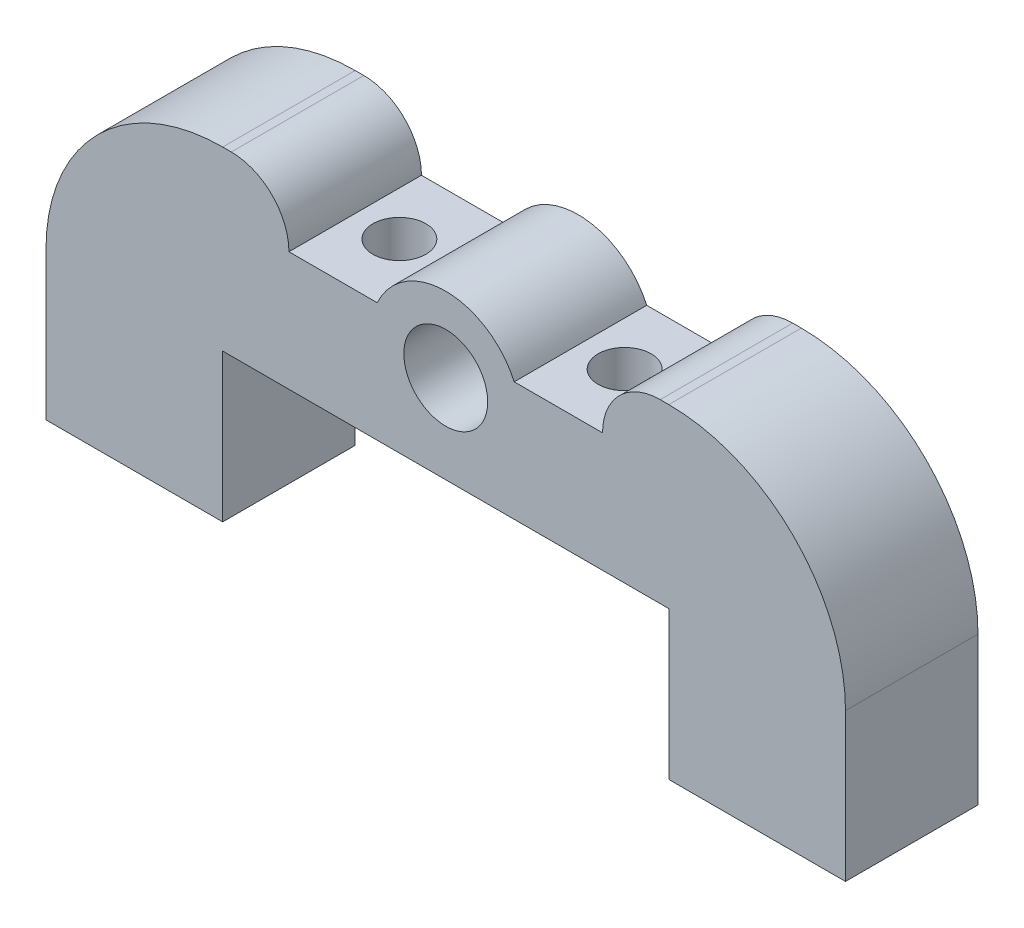
ISO-10303-21;
HEADER;
FILE_DESCRIPTION(('STEP AP214'),'2;1');
FILE_NAME('part.step','',(''),(''),'','','');
FILE_SCHEMA(('AUTOMOTIVE_DESIGN { 1 0 10303 214 1 1 1 1 }'));
ENDSEC;
DATA;
#1=APPLICATION_CONTEXT('core data for automotive mechanical design processes');
#2=APPLICATION_PROTOCOL_DEFINITION('international standard','automotive_design',2000,#1);
#3=PRODUCT_CONTEXT('',#1,'mechanical');
#4=PRODUCT('Part','Part','',(#3));
#5=PRODUCT_RELATED_PRODUCT_CATEGORY('part','',(#4));
#6=PRODUCT_DEFINITION_FORMATION('','',#4);
#7=PRODUCT_DEFINITION_CONTEXT('part definition',#1,'design');
#8=PRODUCT_DEFINITION('design','',#6,#7);
#9=PRODUCT_DEFINITION_SHAPE('','',#8);
#10=(LENGTH_UNIT() NAMED_UNIT(*) SI_UNIT(.MILLI.,.METRE.));
#11=(NAMED_UNIT(*) PLANE_ANGLE_UNIT() SI_UNIT($,.RADIAN.));
#12=(NAMED_UNIT(*) SI_UNIT($,.STERADIAN.) SOLID_ANGLE_UNIT());
#13=UNCERTAINTY_MEASURE_WITH_UNIT(LENGTH_MEASURE(1.E-05),#10,'distance_accuracy_value','');
#14=(GEOMETRIC_REPRESENTATION_CONTEXT(3) GLOBAL_UNCERTAINTY_ASSIGNED_CONTEXT((#13)) GLOBAL_UNIT_ASSIGNED_CONTEXT((#10,
#11,#12)) REPRESENTATION_CONTEXT('',''));
#15=CARTESIAN_POINT('',(0.,0.,0.));
#16=DIRECTION('',(0.,0.,1.));
#17=DIRECTION('',(1.,0.,0.));
#18=AXIS2_PLACEMENT_3D('',#15,#16,#17);
#19=CARTESIAN_POINT('',(0.,12.0931338135657,-0.00100000000000013));
#20=DIRECTION('',(0.,-1.,0.));
#21=DIRECTION('',(0.,0.,-1.));
#22=AXIS2_PLACEMENT_3D('',#19,#20,#21);
#23=PLANE('',#22);
#24=DIRECTION('',(-1.,0.,0.));
#25=VECTOR('',#24,1.);
#26=CARTESIAN_POINT('',(0.,12.0931338135657,0.));
#27=LINE('',#26,#25);
#28=CARTESIAN_POINT('',(7.,12.0931338135657,0.));
#29=VERTEX_POINT('',#28);
#30=CARTESIAN_POINT('',(3.,12.0931338135657,0.));
#31=VERTEX_POINT('',#30);
#32=EDGE_CURVE('E182',#29,#31,#27,.T.);
#33=ORIENTED_EDGE('',*,*,#32,.T.);
#34=DIRECTION('',(0.,0.,1.));
#35=VECTOR('',#34,1.);
#36=CARTESIAN_POINT('',(3.,12.0931338135657,-0.00100000000000013));
#37=LINE('',#36,#35);
#38=CARTESIAN_POINT('',(3.,12.0931338135657,6.));
#39=VERTEX_POINT('',#38);
#40=EDGE_CURVE('E204',#31,#39,#37,.T.);
#41=ORIENTED_EDGE('',*,*,#40,.T.);
#42=DIRECTION('',(1.,0.,0.));
#43=VECTOR('',#42,1.);
#44=CARTESIAN_POINT('',(0.,12.0931338135657,6.));
#45=LINE('',#44,#43);
#46=CARTESIAN_POINT('',(7.,12.0931338135657,6.));
#47=VERTEX_POINT('',#46);
#48=EDGE_CURVE('E177',#39,#47,#45,.T.);
#49=ORIENTED_EDGE('',*,*,#48,.T.);
#50=DIRECTION('',(0.,0.,1.));
#51=VECTOR('',#50,1.);
#52=CARTESIAN_POINT('',(7.,12.0931338135657,-0.00100000000000013));
#53=LINE('',#52,#51);
#54=EDGE_CURVE('E167',#29,#47,#53,.T.);
#55=ORIENTED_EDGE('',*,*,#54,.F.);
#56=EDGE_LOOP('',(#33,#41,#49,#55));
#57=FACE_BOUND('',#56,.T.);
#58=CARTESIAN_POINT('',(5.,12.0931338135657,3.));
#59=DIRECTION('',(0.,1.,0.));
#60=DIRECTION('',(0.,0.,1.));
#61=AXIS2_PLACEMENT_3D('',#58,#59,#60);
#62=CIRCLE('',#61,1.2);
#63=CARTESIAN_POINT('',(5.,12.0931338135657,4.2));
#64=VERTEX_POINT('',#63);
#65=EDGE_CURVE('E399',#64,#64,#62,.T.);
#66=ORIENTED_EDGE('',*,*,#65,.F.);
#67=EDGE_LOOP('',(#66));
#68=FACE_BOUND('',#67,.T.);
#69=ADVANCED_FACE('F40',(#57,#68),#23,.F.);
#70=CARTESIAN_POINT('',(0.,14.7,6.));
#71=DIRECTION('',(0.,1.,0.));
#72=DIRECTION('',(0.,0.,1.));
#73=AXIS2_PLACEMENT_3D('',#70,#71,#72);
#74=PLANE('',#73);
#75=DIRECTION('',(1.,0.,0.));
#76=VECTOR('',#75,1.);
#77=CARTESIAN_POINT('',(0.,14.7,0.));
#78=LINE('',#77,#76);
#79=CARTESIAN_POINT('',(19.8099981186224,14.7,0.));
#80=VERTEX_POINT('',#79);
#81=CARTESIAN_POINT('',(20.2,14.7,0.));
#82=VERTEX_POINT('',#81);
#83=EDGE_CURVE('E287',#80,#82,#78,.T.);
#84=ORIENTED_EDGE('',*,*,#83,.F.);
#85=DIRECTION('',(0.,0.,1.));
#86=VECTOR('',#85,1.);
#87=CARTESIAN_POINT('',(19.8099981186224,14.7,6.));
#88=LINE('',#87,#86);
#89=CARTESIAN_POINT('',(19.8099981186224,14.7,6.));
#90=VERTEX_POINT('',#89);
#91=EDGE_CURVE('E323',#80,#90,#88,.T.);
#92=ORIENTED_EDGE('',*,*,#91,.T.);
#93=DIRECTION('',(1.,0.,0.));
#94=VECTOR('',#93,1.);
#95=CARTESIAN_POINT('',(0.,14.7,6.));
#96=LINE('',#95,#94);
#97=CARTESIAN_POINT('',(20.2,14.7,6.));
#98=VERTEX_POINT('',#97);
#99=EDGE_CURVE('E250',#90,#98,#96,.T.);
#100=ORIENTED_EDGE('',*,*,#99,.T.);
#101=DIRECTION('',(0.,0.,-1.));
#102=VECTOR('',#101,1.);
#103=CARTESIAN_POINT('',(20.2,14.7,6.));
#104=LINE('',#103,#102);
#105=EDGE_CURVE('E292',#98,#82,#104,.T.);
#106=ORIENTED_EDGE('',*,*,#105,.T.);
#107=EDGE_LOOP('',(#84,#92,#100,#106));
#108=FACE_BOUND('',#107,.T.);
#109=ADVANCED_FACE('F340',(#108),#74,.T.);
#110=CARTESIAN_POINT('',(0.,6.7,6.));
#111=DIRECTION('',(0.,0.,-1.));
#112=DIRECTION('',(-1.,0.,0.));
#113=AXIS2_PLACEMENT_3D('',#110,#111,#112);
#114=CYLINDRICAL_SURFACE('',#113,8.);
#115=CARTESIAN_POINT('',(0.,6.7,0.));
#116=DIRECTION('',(0.,0.,1.));
#117=DIRECTION('',(1.,0.,0.));
#118=AXIS2_PLACEMENT_3D('',#115,#116,#117);
#119=CIRCLE('',#118,8.);
#120=CARTESIAN_POINT('',(-8.,6.7,0.));
#121=VERTEX_POINT('',#120);
#122=CARTESIAN_POINT('',(0.,14.7,0.));
#123=VERTEX_POINT('',#122);
#124=EDGE_CURVE('E217',#121,#123,#119,.F.);
#125=ORIENTED_EDGE('',*,*,#124,.F.);
#126=DIRECTION('',(0.,0.,-1.));
#127=VECTOR('',#126,1.);
#128=CARTESIAN_POINT('',(-8.,6.7,6.));
#129=LINE('',#128,#127);
#130=CARTESIAN_POINT('',(-8.,6.7,6.));
#131=VERTEX_POINT('',#130);
#132=EDGE_CURVE('E320',#131,#121,#129,.T.);
#133=ORIENTED_EDGE('',*,*,#132,.F.);
#134=CARTESIAN_POINT('',(0.,6.7,6.));
#135=DIRECTION('',(0.,0.,1.));
#136=DIRECTION('',(1.,0.,0.));
#137=AXIS2_PLACEMENT_3D('',#134,#135,#136);
#138=CIRCLE('',#137,8.);
#139=CARTESIAN_POINT('',(0.,14.7,6.));
#140=VERTEX_POINT('',#139);
#141=EDGE_CURVE('E218',#131,#140,#138,.F.);
#142=ORIENTED_EDGE('',*,*,#141,.T.);
#143=DIRECTION('',(0.,0.,-1.));
#144=VECTOR('',#143,1.);
#145=CARTESIAN_POINT('',(0.,14.7,6.));
#146=LINE('',#145,#144);
#147=EDGE_CURVE('E254',#140,#123,#146,.T.);
#148=ORIENTED_EDGE('',*,*,#147,.T.);
#149=EDGE_LOOP('',(#125,#133,#142,#148));
#150=FACE_BOUND('',#149,.T.);
#151=ADVANCED_FACE('F388',(#150),#114,.T.);
#152=CARTESIAN_POINT('',(-8.,0.,6.));
#153=DIRECTION('',(-1.,0.,0.));
#154=DIRECTION('',(0.,0.,1.));
#155=AXIS2_PLACEMENT_3D('',#152,#153,#154);
#156=PLANE('',#155);
#157=DIRECTION('',(0.,1.,0.));
#158=VECTOR('',#157,1.);
#159=CARTESIAN_POINT('',(-8.,0.,0.));
#160=LINE('',#159,#158);
#161=CARTESIAN_POINT('',(-8.,0.,0.));
#162=VERTEX_POINT('',#161);
#163=EDGE_CURVE('E258',#162,#121,#160,.T.);
#164=ORIENTED_EDGE('',*,*,#163,.F.);
#165=DIRECTION('',(0.,0.,-1.));
#166=VECTOR('',#165,1.);
#167=CARTESIAN_POINT('',(-8.,0.,6.));
#168=LINE('',#167,#166);
#169=CARTESIAN_POINT('',(-8.,0.,6.));
#170=VERTEX_POINT('',#169);
#171=EDGE_CURVE('E317',#170,#162,#168,.T.);
#172=ORIENTED_EDGE('',*,*,#171,.F.);
#173=DIRECTION('',(0.,1.,0.));
#174=VECTOR('',#173,1.);
#175=CARTESIAN_POINT('',(-8.,0.,6.));
#176=LINE('',#175,#174);
#177=EDGE_CURVE('E222',#170,#131,#176,.T.);
#178=ORIENTED_EDGE('',*,*,#177,.T.);
#179=ORIENTED_EDGE('',*,*,#132,.T.);
#180=EDGE_LOOP('',(#164,#172,#178,#179));
#181=FACE_BOUND('',#180,.T.);
#182=ADVANCED_FACE('F384',(#181),#156,.T.);
#183=CARTESIAN_POINT('',(0.,0.,6.));
#184=DIRECTION('',(0.,1.,0.));
#185=DIRECTION('',(0.,0.,1.));
#186=AXIS2_PLACEMENT_3D('',#183,#184,#185);
#187=PLANE('',#186);
#188=DIRECTION('',(1.,0.,0.));
#189=VECTOR('',#188,1.);
#190=CARTESIAN_POINT('',(0.,0.,0.));
#191=LINE('',#190,#189);
#192=CARTESIAN_POINT('',(0.,0.,0.));
#193=VERTEX_POINT('',#192);
#194=EDGE_CURVE('E262',#162,#193,#191,.T.);
#195=ORIENTED_EDGE('',*,*,#194,.T.);
#196=DIRECTION('',(0.,0.,-1.));
#197=VECTOR('',#196,1.);
#198=CARTESIAN_POINT('',(0.,0.,6.));
#199=LINE('',#198,#197);
#200=CARTESIAN_POINT('',(0.,0.,6.));
#201=VERTEX_POINT('',#200);
#202=EDGE_CURVE('E313',#201,#193,#199,.T.);
#203=ORIENTED_EDGE('',*,*,#202,.F.);
#204=DIRECTION('',(1.,0.,0.));
#205=VECTOR('',#204,1.);
#206=CARTESIAN_POINT('',(0.,0.,6.));
#207=LINE('',#206,#205);
#208=EDGE_CURVE('E227',#170,#201,#207,.T.);
#209=ORIENTED_EDGE('',*,*,#208,.F.);
#210=ORIENTED_EDGE('',*,*,#171,.T.);
#211=EDGE_LOOP('',(#195,#203,#209,#210));
#212=FACE_BOUND('',#211,.T.);
#213=ADVANCED_FACE('F380',(#212),#187,.F.);
#214=CARTESIAN_POINT('',(0.,0.,6.));
#215=DIRECTION('',(-1.,0.,0.));
#216=DIRECTION('',(0.,0.,1.));
#217=AXIS2_PLACEMENT_3D('',#214,#215,#216);
#218=PLANE('',#217);
#219=DIRECTION('',(0.,1.,0.));
#220=VECTOR('',#219,1.);
#221=CARTESIAN_POINT('',(0.,0.,0.));
#222=LINE('',#221,#220);
#223=CARTESIAN_POINT('',(0.,6.7,0.));
#224=VERTEX_POINT('',#223);
#225=EDGE_CURVE('E265',#193,#224,#222,.T.);
#226=ORIENTED_EDGE('',*,*,#225,.T.);
#227=DIRECTION('',(0.,0.,-1.));
#228=VECTOR('',#227,1.);
#229=CARTESIAN_POINT('',(0.,6.7,6.));
#230=LINE('',#229,#228);
#231=CARTESIAN_POINT('',(0.,6.7,6.));
#232=VERTEX_POINT('',#231);
#233=EDGE_CURVE('E309',#232,#224,#230,.T.);
#234=ORIENTED_EDGE('',*,*,#233,.F.);
#235=DIRECTION('',(0.,1.,0.));
#236=VECTOR('',#235,1.);
#237=CARTESIAN_POINT('',(0.,0.,6.));
#238=LINE('',#237,#236);
#239=EDGE_CURVE('E230',#201,#232,#238,.T.);
#240=ORIENTED_EDGE('',*,*,#239,.F.);
#241=ORIENTED_EDGE('',*,*,#202,.T.);
#242=EDGE_LOOP('',(#226,#234,#240,#241));
#243=FACE_BOUND('',#242,.T.);
#244=ADVANCED_FACE('F376',(#243),#218,.F.);
#245=CARTESIAN_POINT('',(0.,6.7,6.));
#246=DIRECTION('',(0.,1.,0.));
#247=DIRECTION('',(0.,0.,1.));
#248=AXIS2_PLACEMENT_3D('',#245,#246,#247);
#249=PLANE('',#248);
#250=CARTESIAN_POINT('',(5.,6.7,3.));
#251=DIRECTION('',(0.,1.,0.));
#252=DIRECTION('',(0.,0.,1.));
#253=AXIS2_PLACEMENT_3D('',#250,#251,#252);
#254=CIRCLE('',#253,1.2);
#255=CARTESIAN_POINT('',(5.,6.7,4.2));
#256=VERTEX_POINT('',#255);
#257=EDGE_CURVE('E44',#256,#256,#254,.T.);
#258=ORIENTED_EDGE('',*,*,#257,.T.);
#259=EDGE_LOOP('',(#258));
#260=FACE_BOUND('',#259,.T.);
#261=CARTESIAN_POINT('',(15.2,6.7,3.));
#262=DIRECTION('',(0.,1.,0.));
#263=DIRECTION('',(0.,0.,1.));
#264=AXIS2_PLACEMENT_3D('',#261,#262,#263);
#265=CIRCLE('',#264,1.2);
#266=CARTESIAN_POINT('',(15.2,6.7,4.2));
#267=VERTEX_POINT('',#266);
#268=EDGE_CURVE('E184',#267,#267,#265,.T.);
#269=ORIENTED_EDGE('',*,*,#268,.T.);
#270=EDGE_LOOP('',(#269));
#271=FACE_BOUND('',#270,.T.);
#272=DIRECTION('',(1.,0.,0.));
#273=VECTOR('',#272,1.);
#274=CARTESIAN_POINT('',(0.,6.7,0.));
#275=LINE('',#274,#273);
#276=CARTESIAN_POINT('',(20.2,6.7,0.));
#277=VERTEX_POINT('',#276);
#278=EDGE_CURVE('E268',#224,#277,#275,.T.);
#279=ORIENTED_EDGE('',*,*,#278,.T.);
#280=DIRECTION('',(0.,0.,-1.));
#281=VECTOR('',#280,1.);
#282=CARTESIAN_POINT('',(20.2,6.7,6.));
#283=LINE('',#282,#281);
#284=CARTESIAN_POINT('',(20.2,6.7,6.));
#285=VERTEX_POINT('',#284);
#286=EDGE_CURVE('E306',#285,#277,#283,.T.);
#287=ORIENTED_EDGE('',*,*,#286,.F.);
#288=DIRECTION('',(1.,0.,0.));
#289=VECTOR('',#288,1.);
#290=CARTESIAN_POINT('',(0.,6.7,6.));
#291=LINE('',#290,#289);
#292=EDGE_CURVE('E233',#232,#285,#291,.T.);
#293=ORIENTED_EDGE('',*,*,#292,.F.);
#294=ORIENTED_EDGE('',*,*,#233,.T.);
#295=EDGE_LOOP('',(#279,#287,#293,#294));
#296=FACE_BOUND('',#295,.T.);
#297=ADVANCED_FACE('F371',(#260,#271,#296),#249,.F.);
#298=CARTESIAN_POINT('',(20.2,0.,6.));
#299=DIRECTION('',(-1.,0.,0.));
#300=DIRECTION('',(0.,0.,1.));
#301=AXIS2_PLACEMENT_3D('',#298,#299,#300);
#302=PLANE('',#301);
#303=DIRECTION('',(0.,1.,0.));
#304=VECTOR('',#303,1.);
#305=CARTESIAN_POINT('',(20.2,0.,0.));
#306=LINE('',#305,#304);
#307=CARTESIAN_POINT('',(20.2,0.,0.));
#308=VERTEX_POINT('',#307);
#309=EDGE_CURVE('E272',#308,#277,#306,.T.);
#310=ORIENTED_EDGE('',*,*,#309,.F.);
#311=DIRECTION('',(0.,0.,-1.));
#312=VECTOR('',#311,1.);
#313=CARTESIAN_POINT('',(20.2,0.,6.));
#314=LINE('',#313,#312);
#315=CARTESIAN_POINT('',(20.2,0.,6.));
#316=VERTEX_POINT('',#315);
#317=EDGE_CURVE('E303',#316,#308,#314,.T.);
#318=ORIENTED_EDGE('',*,*,#317,.F.);
#319=DIRECTION('',(0.,1.,0.));
#320=VECTOR('',#319,1.);
#321=CARTESIAN_POINT('',(20.2,0.,6.));
#322=LINE('',#321,#320);
#323=EDGE_CURVE('E236',#316,#285,#322,.T.);
#324=ORIENTED_EDGE('',*,*,#323,.T.);
#325=ORIENTED_EDGE('',*,*,#286,.T.);
#326=EDGE_LOOP('',(#310,#318,#324,#325));
#327=FACE_BOUND('',#326,.T.);
#328=ADVANCED_FACE('F365',(#327),#302,.T.);
#329=CARTESIAN_POINT('',(0.,0.,6.));
#330=DIRECTION('',(0.,1.,0.));
#331=DIRECTION('',(0.,0.,1.));
#332=AXIS2_PLACEMENT_3D('',#329,#330,#331);
#333=PLANE('',#332);
#334=DIRECTION('',(1.,0.,0.));
#335=VECTOR('',#334,1.);
#336=CARTESIAN_POINT('',(0.,0.,0.));
#337=LINE('',#336,#335);
#338=CARTESIAN_POINT('',(28.2,0.,0.));
#339=VERTEX_POINT('',#338);
#340=EDGE_CURVE('E276',#308,#339,#337,.T.);
#341=ORIENTED_EDGE('',*,*,#340,.T.);
#342=DIRECTION('',(0.,0.,-1.));
#343=VECTOR('',#342,1.);
#344=CARTESIAN_POINT('',(28.2,0.,6.));
#345=LINE('',#344,#343);
#346=CARTESIAN_POINT('',(28.2,0.,6.));
#347=VERTEX_POINT('',#346);
#348=EDGE_CURVE('E299',#347,#339,#345,.T.);
#349=ORIENTED_EDGE('',*,*,#348,.F.);
#350=DIRECTION('',(1.,0.,0.));
#351=VECTOR('',#350,1.);
#352=CARTESIAN_POINT('',(0.,0.,6.));
#353=LINE('',#352,#351);
#354=EDGE_CURVE('E240',#316,#347,#353,.T.);
#355=ORIENTED_EDGE('',*,*,#354,.F.);
#356=ORIENTED_EDGE('',*,*,#317,.T.);
#357=EDGE_LOOP('',(#341,#349,#355,#356));
#358=FACE_BOUND('',#357,.T.);
#359=ADVANCED_FACE('F362',(#358),#333,.F.);
#360=CARTESIAN_POINT('',(28.2,0.,6.));
#361=DIRECTION('',(-1.,0.,0.));
#362=DIRECTION('',(0.,-1.,0.));
#363=AXIS2_PLACEMENT_3D('',#360,#361,#362);
#364=PLANE('',#363);
#365=DIRECTION('',(0.,1.,0.));
#366=VECTOR('',#365,1.);
#367=CARTESIAN_POINT('',(28.2,0.,0.));
#368=LINE('',#367,#366);
#369=CARTESIAN_POINT('',(28.2,6.7,0.));
#370=VERTEX_POINT('',#369);
#371=EDGE_CURVE('E279',#339,#370,#368,.T.);
#372=ORIENTED_EDGE('',*,*,#371,.T.);
#373=DIRECTION('',(0.,0.,-1.));
#374=VECTOR('',#373,1.);
#375=CARTESIAN_POINT('',(28.2,6.7,6.));
#376=LINE('',#375,#374);
#377=CARTESIAN_POINT('',(28.2,6.7,6.));
#378=VERTEX_POINT('',#377);
#379=EDGE_CURVE('E296',#378,#370,#376,.T.);
#380=ORIENTED_EDGE('',*,*,#379,.F.);
#381=DIRECTION('',(0.,1.,0.));
#382=VECTOR('',#381,1.);
#383=CARTESIAN_POINT('',(28.2,0.,6.));
#384=LINE('',#383,#382);
#385=EDGE_CURVE('E243',#347,#378,#384,.T.);
#386=ORIENTED_EDGE('',*,*,#385,.F.);
#387=ORIENTED_EDGE('',*,*,#348,.T.);
#388=EDGE_LOOP('',(#372,#380,#386,#387));
#389=FACE_BOUND('',#388,.T.);
#390=ADVANCED_FACE('F357',(#389),#364,.F.);
#391=CARTESIAN_POINT('',(20.2,6.7,6.));
#392=DIRECTION('',(0.,0.,-1.));
#393=DIRECTION('',(-1.,0.,0.));
#394=AXIS2_PLACEMENT_3D('',#391,#392,#393);
#395=CYLINDRICAL_SURFACE('',#394,8.);
#396=CARTESIAN_POINT('',(20.2,6.7,0.));
#397=DIRECTION('',(0.,0.,1.));
#398=DIRECTION('',(1.,0.,0.));
#399=AXIS2_PLACEMENT_3D('',#396,#397,#398);
#400=CIRCLE('',#399,8.);
#401=EDGE_CURVE('E283',#82,#370,#400,.F.);
#402=ORIENTED_EDGE('',*,*,#401,.F.);
#403=ORIENTED_EDGE('',*,*,#105,.F.);
#404=CARTESIAN_POINT('',(20.2,6.7,6.));
#405=DIRECTION('',(0.,0.,1.));
#406=DIRECTION('',(1.,0.,0.));
#407=AXIS2_PLACEMENT_3D('',#404,#405,#406);
#408=CIRCLE('',#407,8.);
#409=EDGE_CURVE('E246',#98,#378,#408,.F.);
#410=ORIENTED_EDGE('',*,*,#409,.T.);
#411=ORIENTED_EDGE('',*,*,#379,.T.);
#412=EDGE_LOOP('',(#402,#403,#410,#411));
#413=FACE_BOUND('',#412,.T.);
#414=ADVANCED_FACE('F351',(#413),#395,.T.);
#415=CARTESIAN_POINT('',(0.390001881377587,14.7,6.));
#416=VERTEX_POINT('',#415);
#417=EDGE_CURVE('E251',#140,#416,#96,.T.);
#418=ORIENTED_EDGE('',*,*,#417,.T.);
#419=DIRECTION('',(0.,0.,-1.));
#420=VECTOR('',#419,1.);
#421=CARTESIAN_POINT('',(0.390001881377587,14.7,0.));
#422=LINE('',#421,#420);
#423=CARTESIAN_POINT('',(0.390001881377587,14.7,0.));
#424=VERTEX_POINT('',#423);
#425=EDGE_CURVE('E11',#416,#424,#422,.T.);
#426=ORIENTED_EDGE('',*,*,#425,.T.);
#427=EDGE_CURVE('E223',#123,#424,#78,.T.);
#428=ORIENTED_EDGE('',*,*,#427,.F.);
#429=ORIENTED_EDGE('',*,*,#147,.F.);
#430=EDGE_LOOP('',(#418,#426,#428,#429));
#431=FACE_BOUND('',#430,.T.);
#432=ADVANCED_FACE('F390',(#431),#74,.T.);
#433=CARTESIAN_POINT('',(0.,0.,6.));
#434=DIRECTION('',(0.,0.,1.));
#435=DIRECTION('',(1.,0.,0.));
#436=AXIS2_PLACEMENT_3D('',#433,#434,#435);
#437=PLANE('',#436);
#438=ORIENTED_EDGE('',*,*,#99,.F.);
#439=CARTESIAN_POINT('',(19.8099981186224,12.09,6.));
#440=DIRECTION('',(0.,0.,1.));
#441=DIRECTION('',(1.,0.,0.));
#442=AXIS2_PLACEMENT_3D('',#439,#440,#441);
#443=CIRCLE('',#442,2.61);
#444=CARTESIAN_POINT('',(17.2,12.0931338135657,6.));
#445=VERTEX_POINT('',#444);
#446=EDGE_CURVE('E329',#90,#445,#443,.T.);
#447=ORIENTED_EDGE('',*,*,#446,.T.);
#448=DIRECTION('',(-1.,0.,0.));
#449=VECTOR('',#448,1.);
#450=CARTESIAN_POINT('',(0.,12.0931338135657,6.));
#451=LINE('',#450,#449);
#452=CARTESIAN_POINT('',(13.2,12.0931338135657,6.));
#453=VERTEX_POINT('',#452);
#454=EDGE_CURVE('E196',#445,#453,#451,.T.);
#455=ORIENTED_EDGE('',*,*,#454,.T.);
#456=CARTESIAN_POINT('',(10.1,10.7,6.));
#457=DIRECTION('',(0.,0.,1.));
#458=DIRECTION('',(1.,0.,0.));
#459=AXIS2_PLACEMENT_3D('',#456,#457,#458);
#460=CIRCLE('',#459,3.39865);
#461=EDGE_CURVE('E174',#453,#47,#460,.T.);
#462=ORIENTED_EDGE('',*,*,#461,.T.);
#463=ORIENTED_EDGE('',*,*,#48,.F.);
#464=CARTESIAN_POINT('',(0.390001881377587,12.09,6.));
#465=DIRECTION('',(0.,0.,1.));
#466=DIRECTION('',(1.,0.,0.));
#467=AXIS2_PLACEMENT_3D('',#464,#465,#466);
#468=CIRCLE('',#467,2.61);
#469=EDGE_CURVE('E63',#39,#416,#468,.T.);
#470=ORIENTED_EDGE('',*,*,#469,.T.);
#471=ORIENTED_EDGE('',*,*,#417,.F.);
#472=ORIENTED_EDGE('',*,*,#141,.F.);
#473=ORIENTED_EDGE('',*,*,#177,.F.);
#474=ORIENTED_EDGE('',*,*,#208,.T.);
#475=ORIENTED_EDGE('',*,*,#239,.T.);
#476=ORIENTED_EDGE('',*,*,#292,.T.);
#477=ORIENTED_EDGE('',*,*,#323,.F.);
#478=ORIENTED_EDGE('',*,*,#354,.T.);
#479=ORIENTED_EDGE('',*,*,#385,.T.);
#480=ORIENTED_EDGE('',*,*,#409,.F.);
#481=EDGE_LOOP('',(#438,#447,#455,#462,#463,#470,#471,#472,#473,#474,#475,#476,#477,#478,#479,#480));
#482=FACE_BOUND('',#481,.T.);
#483=CARTESIAN_POINT('',(10.1,10.7,6.));
#484=DIRECTION('',(0.,0.,1.));
#485=DIRECTION('',(1.,0.,0.));
#486=AXIS2_PLACEMENT_3D('',#483,#484,#485);
#487=CIRCLE('',#486,1.89865);
#488=CARTESIAN_POINT('',(11.99865,10.7,6.));
#489=VERTEX_POINT('',#488);
#490=EDGE_CURVE('E166',#489,#489,#487,.T.);
#491=ORIENTED_EDGE('',*,*,#490,.F.);
#492=EDGE_LOOP('',(#491));
#493=FACE_BOUND('',#492,.T.);
#494=ADVANCED_FACE('F346',(#482,#493),#437,.T.);
#495=CARTESIAN_POINT('',(0.,0.,0.));
#496=DIRECTION('',(0.,0.,1.));
#497=DIRECTION('',(1.,0.,0.));
#498=AXIS2_PLACEMENT_3D('',#495,#496,#497);
#499=PLANE('',#498);
#500=CARTESIAN_POINT('',(10.1,10.7,0.));
#501=DIRECTION('',(0.,0.,1.));
#502=DIRECTION('',(1.,0.,0.));
#503=AXIS2_PLACEMENT_3D('',#500,#501,#502);
#504=CIRCLE('',#503,1.89865);
#505=CARTESIAN_POINT('',(11.99865,10.7,0.));
#506=VERTEX_POINT('',#505);
#507=EDGE_CURVE('E213',#506,#506,#504,.T.);
#508=ORIENTED_EDGE('',*,*,#507,.T.);
#509=EDGE_LOOP('',(#508));
#510=FACE_BOUND('',#509,.T.);
#511=DIRECTION('',(1.,0.,0.));
#512=VECTOR('',#511,1.);
#513=CARTESIAN_POINT('',(0.,12.0931338135657,0.));
#514=LINE('',#513,#512);
#515=CARTESIAN_POINT('',(13.2,12.0931338135657,0.));
#516=VERTEX_POINT('',#515);
#517=CARTESIAN_POINT('',(17.2,12.0931338135657,0.));
#518=VERTEX_POINT('',#517);
#519=EDGE_CURVE('E154',#516,#518,#514,.T.);
#520=ORIENTED_EDGE('',*,*,#519,.T.);
#521=CARTESIAN_POINT('',(19.8099981186224,12.09,0.));
#522=DIRECTION('',(0.,0.,1.));
#523=DIRECTION('',(1.,0.,0.));
#524=AXIS2_PLACEMENT_3D('',#521,#522,#523);
#525=CIRCLE('',#524,2.61);
#526=EDGE_CURVE('E50',#518,#80,#525,.F.);
#527=ORIENTED_EDGE('',*,*,#526,.T.);
#528=ORIENTED_EDGE('',*,*,#83,.T.);
#529=ORIENTED_EDGE('',*,*,#401,.T.);
#530=ORIENTED_EDGE('',*,*,#371,.F.);
#531=ORIENTED_EDGE('',*,*,#340,.F.);
#532=ORIENTED_EDGE('',*,*,#309,.T.);
#533=ORIENTED_EDGE('',*,*,#278,.F.);
#534=ORIENTED_EDGE('',*,*,#225,.F.);
#535=ORIENTED_EDGE('',*,*,#194,.F.);
#536=ORIENTED_EDGE('',*,*,#163,.T.);
#537=ORIENTED_EDGE('',*,*,#124,.T.);
#538=ORIENTED_EDGE('',*,*,#427,.T.);
#539=CARTESIAN_POINT('',(0.390001881377587,12.09,0.));
#540=DIRECTION('',(0.,0.,1.));
#541=DIRECTION('',(1.,0.,0.));
#542=AXIS2_PLACEMENT_3D('',#539,#540,#541);
#543=CIRCLE('',#542,2.61);
#544=EDGE_CURVE('E332',#424,#31,#543,.F.);
#545=ORIENTED_EDGE('',*,*,#544,.T.);
#546=ORIENTED_EDGE('',*,*,#32,.F.);
#547=CARTESIAN_POINT('',(10.1,10.7,0.));
#548=DIRECTION('',(0.,0.,1.));
#549=DIRECTION('',(1.,0.,0.));
#550=AXIS2_PLACEMENT_3D('',#547,#548,#549);
#551=CIRCLE('',#550,3.39865);
#552=EDGE_CURVE('E171',#29,#516,#551,.F.);
#553=ORIENTED_EDGE('',*,*,#552,.T.);
#554=EDGE_LOOP('',(#520,#527,#528,#529,#530,#531,#532,#533,#534,#535,#536,#537,#538,#545,#546,#553));
#555=FACE_BOUND('',#554,.T.);
#556=ADVANCED_FACE('F180',(#510,#555),#499,.F.);
#557=CARTESIAN_POINT('',(10.1,10.7,6.));
#558=DIRECTION('',(0.,0.,1.));
#559=DIRECTION('',(1.,0.,0.));
#560=AXIS2_PLACEMENT_3D('',#557,#558,#559);
#561=CYLINDRICAL_SURFACE('',#560,1.89865);
#562=ORIENTED_EDGE('',*,*,#507,.F.);
#563=EDGE_LOOP('',(#562));
#564=FACE_BOUND('',#563,.T.);
#565=ORIENTED_EDGE('',*,*,#490,.T.);
#566=EDGE_LOOP('',(#565));
#567=FACE_BOUND('',#566,.T.);
#568=ADVANCED_FACE('F420',(#564,#567),#561,.F.);
#569=CARTESIAN_POINT('',(10.1,10.7,-0.00100000000000013));
#570=DIRECTION('',(0.,0.,1.));
#571=DIRECTION('',(1.,0.,0.));
#572=AXIS2_PLACEMENT_3D('',#569,#570,#571);
#573=CYLINDRICAL_SURFACE('',#572,3.39865);
#574=ORIENTED_EDGE('',*,*,#54,.T.);
#575=ORIENTED_EDGE('',*,*,#461,.F.);
#576=DIRECTION('',(0.,0.,1.));
#577=VECTOR('',#576,1.);
#578=CARTESIAN_POINT('',(13.2,12.0931338135657,-0.00100000000000013));
#579=LINE('',#578,#577);
#580=EDGE_CURVE('E158',#516,#453,#579,.T.);
#581=ORIENTED_EDGE('',*,*,#580,.F.);
#582=ORIENTED_EDGE('',*,*,#552,.F.);
#583=EDGE_LOOP('',(#574,#575,#581,#582));
#584=FACE_BOUND('',#583,.T.);
#585=ADVANCED_FACE('F170',(#584),#573,.T.);
#586=CARTESIAN_POINT('',(0.,12.0931338135657,-0.00100000000000013));
#587=DIRECTION('',(0.,1.,0.));
#588=DIRECTION('',(-1.,0.,0.));
#589=AXIS2_PLACEMENT_3D('',#586,#587,#588);
#590=PLANE('',#589);
#591=CARTESIAN_POINT('',(15.2,12.0931338135657,3.));
#592=DIRECTION('',(0.,1.,0.));
#593=DIRECTION('',(0.,0.,1.));
#594=AXIS2_PLACEMENT_3D('',#591,#592,#593);
#595=CIRCLE('',#594,1.2);
#596=CARTESIAN_POINT('',(15.2,12.0931338135657,4.2));
#597=VERTEX_POINT('',#596);
#598=EDGE_CURVE('E190',#597,#597,#595,.T.);
#599=ORIENTED_EDGE('',*,*,#598,.F.);
#600=EDGE_LOOP('',(#599));
#601=FACE_BOUND('',#600,.T.);
#602=ORIENTED_EDGE('',*,*,#580,.T.);
#603=ORIENTED_EDGE('',*,*,#454,.F.);
#604=DIRECTION('',(0.,0.,1.));
#605=VECTOR('',#604,1.);
#606=CARTESIAN_POINT('',(17.2,12.0931338135657,-0.00100000000000013));
#607=LINE('',#606,#605);
#608=EDGE_CURVE('E161',#518,#445,#607,.T.);
#609=ORIENTED_EDGE('',*,*,#608,.F.);
#610=ORIENTED_EDGE('',*,*,#519,.F.);
#611=EDGE_LOOP('',(#602,#603,#609,#610));
#612=FACE_BOUND('',#611,.T.);
#613=ADVANCED_FACE('F156',(#601,#612),#590,.T.);
#614=CARTESIAN_POINT('',(19.8099981186224,12.09,-0.00100000000000013));
#615=DIRECTION('',(0.,0.,-1.));
#616=DIRECTION('',(-1.,0.,0.));
#617=AXIS2_PLACEMENT_3D('',#614,#615,#616);
#618=CYLINDRICAL_SURFACE('',#617,2.61);
#619=ORIENTED_EDGE('',*,*,#526,.F.);
#620=ORIENTED_EDGE('',*,*,#608,.T.);
#621=ORIENTED_EDGE('',*,*,#446,.F.);
#622=ORIENTED_EDGE('',*,*,#91,.F.);
#623=EDGE_LOOP('',(#619,#620,#621,#622));
#624=FACE_BOUND('',#623,.T.);
#625=ADVANCED_FACE('F345',(#624),#618,.T.);
#626=CARTESIAN_POINT('',(0.390001881377587,12.09,-0.00100000000000013));
#627=DIRECTION('',(0.,0.,1.));
#628=DIRECTION('',(1.,0.,0.));
#629=AXIS2_PLACEMENT_3D('',#626,#627,#628);
#630=CYLINDRICAL_SURFACE('',#629,2.61);
#631=ORIENTED_EDGE('',*,*,#544,.F.);
#632=ORIENTED_EDGE('',*,*,#425,.F.);
#633=ORIENTED_EDGE('',*,*,#469,.F.);
#634=ORIENTED_EDGE('',*,*,#40,.F.);
#635=EDGE_LOOP('',(#631,#632,#633,#634));
#636=FACE_BOUND('',#635,.T.);
#637=ADVANCED_FACE('F42',(#636),#630,.T.);
#638=CARTESIAN_POINT('',(15.2,12.0931338135657,3.));
#639=DIRECTION('',(0.,1.,0.));
#640=DIRECTION('',(0.,0.,1.));
#641=AXIS2_PLACEMENT_3D('',#638,#639,#640);
#642=CYLINDRICAL_SURFACE('',#641,1.2);
#643=ORIENTED_EDGE('',*,*,#598,.T.);
#644=EDGE_LOOP('',(#643));
#645=FACE_BOUND('',#644,.T.);
#646=ORIENTED_EDGE('',*,*,#268,.F.);
#647=EDGE_LOOP('',(#646));
#648=FACE_BOUND('',#647,.T.);
#649=ADVANCED_FACE('F409',(#645,#648),#642,.F.);
#650=CARTESIAN_POINT('',(5.,12.0931338135657,3.));
#651=DIRECTION('',(0.,1.,0.));
#652=DIRECTION('',(0.,0.,1.));
#653=AXIS2_PLACEMENT_3D('',#650,#651,#652);
#654=CYLINDRICAL_SURFACE('',#653,1.2);
#655=ORIENTED_EDGE('',*,*,#65,.T.);
#656=EDGE_LOOP('',(#655));
#657=FACE_BOUND('',#656,.T.);
#658=ORIENTED_EDGE('',*,*,#257,.F.);
#659=EDGE_LOOP('',(#658));
#660=FACE_BOUND('',#659,.T.);
#661=ADVANCED_FACE('F570',(#657,#660),#654,.F.);
#662=CLOSED_SHELL('',(#69,#109,#151,#182,#213,#244,#297,#328,#359,#390,#414,#432,#494,#556,#568,
#585,#613,#625,#637,#649,#661));
#663=MANIFOLD_SOLID_BREP('B2',#662);
#664=ADVANCED_BREP_SHAPE_REPRESENTATION('',(#18,#663),#14);
#665=SHAPE_DEFINITION_REPRESENTATION(#9,#664);
ENDSEC;
END-ISO-10303-21;
